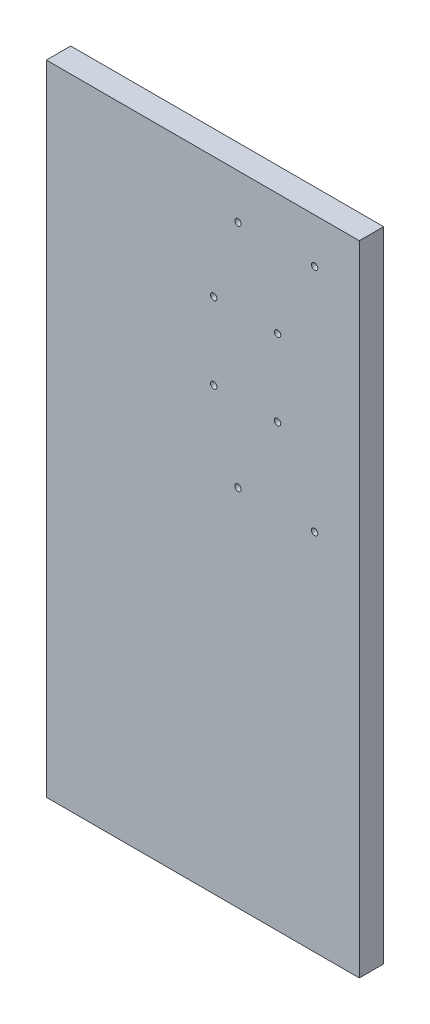
ISO-10303-21;
HEADER;
FILE_DESCRIPTION(('STEP AP214'),'2;1');
FILE_NAME('part.step','',(''),(''),'','','');
FILE_SCHEMA(('AUTOMOTIVE_DESIGN { 1 0 10303 214 1 1 1 1 }'));
ENDSEC;
DATA;
#1=APPLICATION_CONTEXT('core data for automotive mechanical design processes');
#2=APPLICATION_PROTOCOL_DEFINITION('international standard','automotive_design',2000,#1);
#3=PRODUCT_CONTEXT('',#1,'mechanical');
#4=PRODUCT('Part','Part','',(#3));
#5=PRODUCT_RELATED_PRODUCT_CATEGORY('part','',(#4));
#6=PRODUCT_DEFINITION_FORMATION('','',#4);
#7=PRODUCT_DEFINITION_CONTEXT('part definition',#1,'design');
#8=PRODUCT_DEFINITION('design','',#6,#7);
#9=PRODUCT_DEFINITION_SHAPE('','',#8);
#10=(LENGTH_UNIT() NAMED_UNIT(*) SI_UNIT(.MILLI.,.METRE.));
#11=(NAMED_UNIT(*) PLANE_ANGLE_UNIT() SI_UNIT($,.RADIAN.));
#12=(NAMED_UNIT(*) SI_UNIT($,.STERADIAN.) SOLID_ANGLE_UNIT());
#13=UNCERTAINTY_MEASURE_WITH_UNIT(LENGTH_MEASURE(1.E-05),#10,'distance_accuracy_value','');
#14=(GEOMETRIC_REPRESENTATION_CONTEXT(3) GLOBAL_UNCERTAINTY_ASSIGNED_CONTEXT((#13)) GLOBAL_UNIT_ASSIGNED_CONTEXT((#10,
#11,#12)) REPRESENTATION_CONTEXT('',''));
#15=CARTESIAN_POINT('',(0.,0.,0.));
#16=DIRECTION('',(0.,0.,1.));
#17=DIRECTION('',(1.,0.,0.));
#18=AXIS2_PLACEMENT_3D('',#15,#16,#17);
#19=CARTESIAN_POINT('',(-245.05,250.,19.05));
#20=DIRECTION('',(1.,0.,0.));
#21=DIRECTION('',(0.,0.,-1.));
#22=AXIS2_PLACEMENT_3D('',#19,#20,#21);
#23=PLANE('',#22);
#24=DIRECTION('',(0.,-1.,0.));
#25=VECTOR('',#24,1.);
#26=CARTESIAN_POINT('',(-245.05,250.,0.));
#27=LINE('',#26,#25);
#28=CARTESIAN_POINT('',(-245.05,250.,0.));
#29=VERTEX_POINT('',#28);
#30=CARTESIAN_POINT('',(-245.05,-250.,0.));
#31=VERTEX_POINT('',#30);
#32=EDGE_CURVE('E95',#29,#31,#27,.T.);
#33=ORIENTED_EDGE('',*,*,#32,.T.);
#34=DIRECTION('',(0.,0.,-1.));
#35=VECTOR('',#34,1.);
#36=CARTESIAN_POINT('',(-245.05,-250.,19.05));
#37=LINE('',#36,#35);
#38=CARTESIAN_POINT('',(-245.05,-250.,19.05));
#39=VERTEX_POINT('',#38);
#40=EDGE_CURVE('E11',#39,#31,#37,.T.);
#41=ORIENTED_EDGE('',*,*,#40,.F.);
#42=DIRECTION('',(0.,-1.,0.));
#43=VECTOR('',#42,1.);
#44=CARTESIAN_POINT('',(-245.05,250.,19.05));
#45=LINE('',#44,#43);
#46=CARTESIAN_POINT('',(-245.05,250.,19.05));
#47=VERTEX_POINT('',#46);
#48=EDGE_CURVE('E83',#47,#39,#45,.T.);
#49=ORIENTED_EDGE('',*,*,#48,.F.);
#50=DIRECTION('',(0.,0.,-1.));
#51=VECTOR('',#50,1.);
#52=CARTESIAN_POINT('',(-245.05,250.,19.05));
#53=LINE('',#52,#51);
#54=EDGE_CURVE('E91',#47,#29,#53,.T.);
#55=ORIENTED_EDGE('',*,*,#54,.T.);
#56=EDGE_LOOP('',(#33,#41,#49,#55));
#57=FACE_BOUND('',#56,.T.);
#58=ADVANCED_FACE('F32',(#57),#23,.F.);
#59=CARTESIAN_POINT('',(-245.05,-250.,19.05));
#60=DIRECTION('',(0.,1.,0.));
#61=DIRECTION('',(0.,0.,1.));
#62=AXIS2_PLACEMENT_3D('',#59,#60,#61);
#63=PLANE('',#62);
#64=DIRECTION('',(1.,0.,0.));
#65=VECTOR('',#64,1.);
#66=CARTESIAN_POINT('',(-245.05,-250.,0.));
#67=LINE('',#66,#65);
#68=CARTESIAN_POINT('',(0.,-250.,0.));
#69=VERTEX_POINT('',#68);
#70=EDGE_CURVE('E87',#31,#69,#67,.T.);
#71=ORIENTED_EDGE('',*,*,#70,.T.);
#72=DIRECTION('',(0.,0.,-1.));
#73=VECTOR('',#72,1.);
#74=CARTESIAN_POINT('',(0.,-250.,19.05));
#75=LINE('',#74,#73);
#76=CARTESIAN_POINT('',(0.,-250.,19.05));
#77=VERTEX_POINT('',#76);
#78=EDGE_CURVE('E40',#77,#69,#75,.T.);
#79=ORIENTED_EDGE('',*,*,#78,.F.);
#80=DIRECTION('',(1.,0.,0.));
#81=VECTOR('',#80,1.);
#82=CARTESIAN_POINT('',(-245.05,-250.,19.05));
#83=LINE('',#82,#81);
#84=EDGE_CURVE('E78',#39,#77,#83,.T.);
#85=ORIENTED_EDGE('',*,*,#84,.F.);
#86=ORIENTED_EDGE('',*,*,#40,.T.);
#87=EDGE_LOOP('',(#71,#79,#85,#86));
#88=FACE_BOUND('',#87,.T.);
#89=ADVANCED_FACE('F86',(#88),#63,.F.);
#90=CARTESIAN_POINT('',(0.,250.,19.05));
#91=DIRECTION('',(-1.,0.,0.));
#92=DIRECTION('',(0.,0.,1.));
#93=AXIS2_PLACEMENT_3D('',#90,#91,#92);
#94=PLANE('',#93);
#95=DIRECTION('',(0.,1.,0.));
#96=VECTOR('',#95,1.);
#97=CARTESIAN_POINT('',(0.,250.,0.));
#98=LINE('',#97,#96);
#99=CARTESIAN_POINT('',(0.,250.,0.));
#100=VERTEX_POINT('',#99);
#101=EDGE_CURVE('E65',#69,#100,#98,.T.);
#102=ORIENTED_EDGE('',*,*,#101,.T.);
#103=DIRECTION('',(0.,0.,-1.));
#104=VECTOR('',#103,1.);
#105=CARTESIAN_POINT('',(0.,250.,19.05));
#106=LINE('',#105,#104);
#107=CARTESIAN_POINT('',(0.,250.,19.05));
#108=VERTEX_POINT('',#107);
#109=EDGE_CURVE('E88',#108,#100,#106,.T.);
#110=ORIENTED_EDGE('',*,*,#109,.F.);
#111=DIRECTION('',(0.,1.,0.));
#112=VECTOR('',#111,1.);
#113=CARTESIAN_POINT('',(0.,250.,19.05));
#114=LINE('',#113,#112);
#115=EDGE_CURVE('E81',#77,#108,#114,.T.);
#116=ORIENTED_EDGE('',*,*,#115,.F.);
#117=ORIENTED_EDGE('',*,*,#78,.T.);
#118=EDGE_LOOP('',(#102,#110,#116,#117));
#119=FACE_BOUND('',#118,.T.);
#120=ADVANCED_FACE('F89',(#119),#94,.F.);
#121=CARTESIAN_POINT('',(-245.05,250.,19.05));
#122=DIRECTION('',(0.,-1.,0.));
#123=DIRECTION('',(0.,0.,-1.));
#124=AXIS2_PLACEMENT_3D('',#121,#122,#123);
#125=PLANE('',#124);
#126=DIRECTION('',(-1.,0.,0.));
#127=VECTOR('',#126,1.);
#128=CARTESIAN_POINT('',(-245.05,250.,0.));
#129=LINE('',#128,#127);
#130=EDGE_CURVE('E71',#100,#29,#129,.T.);
#131=ORIENTED_EDGE('',*,*,#130,.T.);
#132=ORIENTED_EDGE('',*,*,#54,.F.);
#133=DIRECTION('',(-1.,0.,0.));
#134=VECTOR('',#133,1.);
#135=CARTESIAN_POINT('',(-245.05,250.,19.05));
#136=LINE('',#135,#134);
#137=EDGE_CURVE('E48',#108,#47,#136,.T.);
#138=ORIENTED_EDGE('',*,*,#137,.F.);
#139=ORIENTED_EDGE('',*,*,#109,.T.);
#140=EDGE_LOOP('',(#131,#132,#138,#139));
#141=FACE_BOUND('',#140,.T.);
#142=ADVANCED_FACE('F103',(#141),#125,.F.);
#143=CARTESIAN_POINT('',(0.,0.,19.05));
#144=DIRECTION('',(0.,0.,1.));
#145=DIRECTION('',(1.,0.,0.));
#146=AXIS2_PLACEMENT_3D('',#143,#144,#145);
#147=PLANE('',#146);
#148=CARTESIAN_POINT('',(-35.,35.,19.05));
#149=DIRECTION('',(0.,0.,1.));
#150=DIRECTION('',(1.,0.,0.));
#151=AXIS2_PLACEMENT_3D('',#148,#149,#150);
#152=CIRCLE('',#151,2.5);
#153=CARTESIAN_POINT('',(-32.5,35.,19.05));
#154=VERTEX_POINT('',#153);
#155=EDGE_CURVE('E150',#154,#154,#152,.T.);
#156=ORIENTED_EDGE('',*,*,#155,.F.);
#157=EDGE_LOOP('',(#156));
#158=FACE_BOUND('',#157,.T.);
#159=CARTESIAN_POINT('',(-95.,35.,19.05));
#160=DIRECTION('',(0.,0.,1.));
#161=DIRECTION('',(1.,0.,0.));
#162=AXIS2_PLACEMENT_3D('',#159,#160,#161);
#163=CIRCLE('',#162,2.5);
#164=CARTESIAN_POINT('',(-92.5,35.,19.05));
#165=VERTEX_POINT('',#164);
#166=EDGE_CURVE('E144',#165,#165,#163,.T.);
#167=ORIENTED_EDGE('',*,*,#166,.F.);
#168=EDGE_LOOP('',(#167));
#169=FACE_BOUND('',#168,.T.);
#170=CARTESIAN_POINT('',(-114.,95.0000000000003,19.05));
#171=DIRECTION('',(0.,0.,1.));
#172=DIRECTION('',(1.,0.,0.));
#173=AXIS2_PLACEMENT_3D('',#170,#171,#172);
#174=CIRCLE('',#173,2.5);
#175=CARTESIAN_POINT('',(-111.5,95.0000000000003,19.05));
#176=VERTEX_POINT('',#175);
#177=EDGE_CURVE('E138',#176,#176,#174,.T.);
#178=ORIENTED_EDGE('',*,*,#177,.F.);
#179=EDGE_LOOP('',(#178));
#180=FACE_BOUND('',#179,.T.);
#181=CARTESIAN_POINT('',(-64.0000000000019,95.0000000000772,19.05));
#182=DIRECTION('',(0.,0.,1.));
#183=DIRECTION('',(1.,0.,0.));
#184=AXIS2_PLACEMENT_3D('',#181,#182,#183);
#185=CIRCLE('',#184,2.5);
#186=CARTESIAN_POINT('',(-61.5000000000019,95.0000000000772,19.05));
#187=VERTEX_POINT('',#186);
#188=EDGE_CURVE('E132',#187,#187,#185,.T.);
#189=ORIENTED_EDGE('',*,*,#188,.F.);
#190=EDGE_LOOP('',(#189));
#191=FACE_BOUND('',#190,.T.);
#192=CARTESIAN_POINT('',(-64.0000000000019,155.000000000077,19.05));
#193=DIRECTION('',(0.,0.,1.));
#194=DIRECTION('',(1.,0.,0.));
#195=AXIS2_PLACEMENT_3D('',#192,#193,#194);
#196=CIRCLE('',#195,2.5);
#197=CARTESIAN_POINT('',(-61.5000000000019,155.000000000077,19.05));
#198=VERTEX_POINT('',#197);
#199=EDGE_CURVE('E126',#198,#198,#196,.T.);
#200=ORIENTED_EDGE('',*,*,#199,.F.);
#201=EDGE_LOOP('',(#200));
#202=FACE_BOUND('',#201,.T.);
#203=CARTESIAN_POINT('',(-35.,215.,19.05));
#204=DIRECTION('',(0.,0.,1.));
#205=DIRECTION('',(1.,0.,0.));
#206=AXIS2_PLACEMENT_3D('',#203,#204,#205);
#207=CIRCLE('',#206,2.5);
#208=CARTESIAN_POINT('',(-32.5,215.,19.05));
#209=VERTEX_POINT('',#208);
#210=EDGE_CURVE('E120',#209,#209,#207,.T.);
#211=ORIENTED_EDGE('',*,*,#210,.F.);
#212=EDGE_LOOP('',(#211));
#213=FACE_BOUND('',#212,.T.);
#214=CARTESIAN_POINT('',(-95.,215.,19.05));
#215=DIRECTION('',(0.,0.,1.));
#216=DIRECTION('',(1.,0.,0.));
#217=AXIS2_PLACEMENT_3D('',#214,#215,#216);
#218=CIRCLE('',#217,2.5);
#219=CARTESIAN_POINT('',(-92.5,215.,19.05));
#220=VERTEX_POINT('',#219);
#221=EDGE_CURVE('E114',#220,#220,#218,.T.);
#222=ORIENTED_EDGE('',*,*,#221,.F.);
#223=EDGE_LOOP('',(#222));
#224=FACE_BOUND('',#223,.T.);
#225=CARTESIAN_POINT('',(-114.,155.,19.05));
#226=DIRECTION('',(0.,0.,1.));
#227=DIRECTION('',(1.,0.,0.));
#228=AXIS2_PLACEMENT_3D('',#225,#226,#227);
#229=CIRCLE('',#228,2.5);
#230=CARTESIAN_POINT('',(-111.5,155.,19.05));
#231=VERTEX_POINT('',#230);
#232=EDGE_CURVE('E98',#231,#231,#229,.T.);
#233=ORIENTED_EDGE('',*,*,#232,.F.);
#234=EDGE_LOOP('',(#233));
#235=FACE_BOUND('',#234,.T.);
#236=ORIENTED_EDGE('',*,*,#48,.T.);
#237=ORIENTED_EDGE('',*,*,#84,.T.);
#238=ORIENTED_EDGE('',*,*,#115,.T.);
#239=ORIENTED_EDGE('',*,*,#137,.T.);
#240=EDGE_LOOP('',(#236,#237,#238,#239));
#241=FACE_BOUND('',#240,.T.);
#242=ADVANCED_FACE('F79',(#158,#169,#180,#191,#202,#213,#224,#235,#241),#147,.T.);
#243=CARTESIAN_POINT('',(0.,0.,0.));
#244=DIRECTION('',(0.,0.,1.));
#245=DIRECTION('',(1.,0.,0.));
#246=AXIS2_PLACEMENT_3D('',#243,#244,#245);
#247=PLANE('',#246);
#248=CARTESIAN_POINT('',(-35.,35.,0.));
#249=DIRECTION('',(0.,0.,-1.));
#250=DIRECTION('',(-1.,0.,0.));
#251=AXIS2_PLACEMENT_3D('',#248,#249,#250);
#252=CIRCLE('',#251,2.5);
#253=CARTESIAN_POINT('',(-37.5,35.,0.));
#254=VERTEX_POINT('',#253);
#255=EDGE_CURVE('E153',#254,#254,#252,.T.);
#256=ORIENTED_EDGE('',*,*,#255,.F.);
#257=EDGE_LOOP('',(#256));
#258=FACE_BOUND('',#257,.T.);
#259=CARTESIAN_POINT('',(-95.,35.,0.));
#260=DIRECTION('',(0.,0.,-1.));
#261=DIRECTION('',(-1.,0.,0.));
#262=AXIS2_PLACEMENT_3D('',#259,#260,#261);
#263=CIRCLE('',#262,2.5);
#264=CARTESIAN_POINT('',(-97.5,35.,0.));
#265=VERTEX_POINT('',#264);
#266=EDGE_CURVE('E147',#265,#265,#263,.T.);
#267=ORIENTED_EDGE('',*,*,#266,.F.);
#268=EDGE_LOOP('',(#267));
#269=FACE_BOUND('',#268,.T.);
#270=CARTESIAN_POINT('',(-114.,95.0000000000003,0.));
#271=DIRECTION('',(0.,0.,-1.));
#272=DIRECTION('',(-1.,0.,0.));
#273=AXIS2_PLACEMENT_3D('',#270,#271,#272);
#274=CIRCLE('',#273,2.5);
#275=CARTESIAN_POINT('',(-116.5,95.0000000000003,0.));
#276=VERTEX_POINT('',#275);
#277=EDGE_CURVE('E141',#276,#276,#274,.T.);
#278=ORIENTED_EDGE('',*,*,#277,.F.);
#279=EDGE_LOOP('',(#278));
#280=FACE_BOUND('',#279,.T.);
#281=CARTESIAN_POINT('',(-64.0000000000019,95.0000000000772,0.));
#282=DIRECTION('',(0.,0.,-1.));
#283=DIRECTION('',(-1.,0.,0.));
#284=AXIS2_PLACEMENT_3D('',#281,#282,#283);
#285=CIRCLE('',#284,2.5);
#286=CARTESIAN_POINT('',(-66.5000000000019,95.0000000000772,0.));
#287=VERTEX_POINT('',#286);
#288=EDGE_CURVE('E135',#287,#287,#285,.T.);
#289=ORIENTED_EDGE('',*,*,#288,.F.);
#290=EDGE_LOOP('',(#289));
#291=FACE_BOUND('',#290,.T.);
#292=CARTESIAN_POINT('',(-64.0000000000019,155.000000000077,0.));
#293=DIRECTION('',(0.,0.,-1.));
#294=DIRECTION('',(-1.,0.,0.));
#295=AXIS2_PLACEMENT_3D('',#292,#293,#294);
#296=CIRCLE('',#295,2.5);
#297=CARTESIAN_POINT('',(-66.5000000000019,155.000000000077,0.));
#298=VERTEX_POINT('',#297);
#299=EDGE_CURVE('E129',#298,#298,#296,.T.);
#300=ORIENTED_EDGE('',*,*,#299,.F.);
#301=EDGE_LOOP('',(#300));
#302=FACE_BOUND('',#301,.T.);
#303=CARTESIAN_POINT('',(-35.,215.,0.));
#304=DIRECTION('',(0.,0.,-1.));
#305=DIRECTION('',(-1.,0.,0.));
#306=AXIS2_PLACEMENT_3D('',#303,#304,#305);
#307=CIRCLE('',#306,2.5);
#308=CARTESIAN_POINT('',(-37.5,215.,0.));
#309=VERTEX_POINT('',#308);
#310=EDGE_CURVE('E123',#309,#309,#307,.T.);
#311=ORIENTED_EDGE('',*,*,#310,.F.);
#312=EDGE_LOOP('',(#311));
#313=FACE_BOUND('',#312,.T.);
#314=CARTESIAN_POINT('',(-95.,215.,0.));
#315=DIRECTION('',(0.,0.,-1.));
#316=DIRECTION('',(-1.,0.,0.));
#317=AXIS2_PLACEMENT_3D('',#314,#315,#316);
#318=CIRCLE('',#317,2.5);
#319=CARTESIAN_POINT('',(-97.5,215.,0.));
#320=VERTEX_POINT('',#319);
#321=EDGE_CURVE('E117',#320,#320,#318,.T.);
#322=ORIENTED_EDGE('',*,*,#321,.F.);
#323=EDGE_LOOP('',(#322));
#324=FACE_BOUND('',#323,.T.);
#325=CARTESIAN_POINT('',(-114.,155.,0.));
#326=DIRECTION('',(0.,0.,-1.));
#327=DIRECTION('',(-1.,0.,0.));
#328=AXIS2_PLACEMENT_3D('',#325,#326,#327);
#329=CIRCLE('',#328,2.5);
#330=CARTESIAN_POINT('',(-116.5,155.,0.));
#331=VERTEX_POINT('',#330);
#332=EDGE_CURVE('E111',#331,#331,#329,.T.);
#333=ORIENTED_EDGE('',*,*,#332,.F.);
#334=EDGE_LOOP('',(#333));
#335=FACE_BOUND('',#334,.T.);
#336=ORIENTED_EDGE('',*,*,#32,.F.);
#337=ORIENTED_EDGE('',*,*,#130,.F.);
#338=ORIENTED_EDGE('',*,*,#101,.F.);
#339=ORIENTED_EDGE('',*,*,#70,.F.);
#340=EDGE_LOOP('',(#336,#337,#338,#339));
#341=FACE_BOUND('',#340,.T.);
#342=ADVANCED_FACE('F106',(#258,#269,#280,#291,#302,#313,#324,#335,#341),#247,.F.);
#343=CARTESIAN_POINT('',(-114.,155.,0.));
#344=DIRECTION('',(0.,0.,-1.));
#345=DIRECTION('',(-1.,0.,0.));
#346=AXIS2_PLACEMENT_3D('',#343,#344,#345);
#347=CYLINDRICAL_SURFACE('',#346,2.5);
#348=ORIENTED_EDGE('',*,*,#232,.T.);
#349=EDGE_LOOP('',(#348));
#350=FACE_BOUND('',#349,.T.);
#351=ORIENTED_EDGE('',*,*,#332,.T.);
#352=EDGE_LOOP('',(#351));
#353=FACE_BOUND('',#352,.T.);
#354=ADVANCED_FACE('F161',(#350,#353),#347,.F.);
#355=CARTESIAN_POINT('',(-95.,215.,0.));
#356=DIRECTION('',(0.,0.,-1.));
#357=DIRECTION('',(-1.,0.,0.));
#358=AXIS2_PLACEMENT_3D('',#355,#356,#357);
#359=CYLINDRICAL_SURFACE('',#358,2.5);
#360=ORIENTED_EDGE('',*,*,#221,.T.);
#361=EDGE_LOOP('',(#360));
#362=FACE_BOUND('',#361,.T.);
#363=ORIENTED_EDGE('',*,*,#321,.T.);
#364=EDGE_LOOP('',(#363));
#365=FACE_BOUND('',#364,.T.);
#366=ADVANCED_FACE('F178',(#362,#365),#359,.F.);
#367=CARTESIAN_POINT('',(-35.,215.,0.));
#368=DIRECTION('',(0.,0.,-1.));
#369=DIRECTION('',(-1.,0.,0.));
#370=AXIS2_PLACEMENT_3D('',#367,#368,#369);
#371=CYLINDRICAL_SURFACE('',#370,2.5);
#372=ORIENTED_EDGE('',*,*,#210,.T.);
#373=EDGE_LOOP('',(#372));
#374=FACE_BOUND('',#373,.T.);
#375=ORIENTED_EDGE('',*,*,#310,.T.);
#376=EDGE_LOOP('',(#375));
#377=FACE_BOUND('',#376,.T.);
#378=ADVANCED_FACE('F185',(#374,#377),#371,.F.);
#379=CARTESIAN_POINT('',(-64.0000000000019,155.000000000077,0.));
#380=DIRECTION('',(0.,0.,-1.));
#381=DIRECTION('',(-1.,0.,0.));
#382=AXIS2_PLACEMENT_3D('',#379,#380,#381);
#383=CYLINDRICAL_SURFACE('',#382,2.5);
#384=ORIENTED_EDGE('',*,*,#199,.T.);
#385=EDGE_LOOP('',(#384));
#386=FACE_BOUND('',#385,.T.);
#387=ORIENTED_EDGE('',*,*,#299,.T.);
#388=EDGE_LOOP('',(#387));
#389=FACE_BOUND('',#388,.T.);
#390=ADVANCED_FACE('F223',(#386,#389),#383,.F.);
#391=CARTESIAN_POINT('',(-64.0000000000019,95.0000000000772,0.));
#392=DIRECTION('',(0.,0.,-1.));
#393=DIRECTION('',(-1.,0.,0.));
#394=AXIS2_PLACEMENT_3D('',#391,#392,#393);
#395=CYLINDRICAL_SURFACE('',#394,2.5);
#396=ORIENTED_EDGE('',*,*,#188,.T.);
#397=EDGE_LOOP('',(#396));
#398=FACE_BOUND('',#397,.T.);
#399=ORIENTED_EDGE('',*,*,#288,.T.);
#400=EDGE_LOOP('',(#399));
#401=FACE_BOUND('',#400,.T.);
#402=ADVANCED_FACE('F228',(#398,#401),#395,.F.);
#403=CARTESIAN_POINT('',(-114.,95.0000000000003,0.));
#404=DIRECTION('',(0.,0.,-1.));
#405=DIRECTION('',(-1.,0.,0.));
#406=AXIS2_PLACEMENT_3D('',#403,#404,#405);
#407=CYLINDRICAL_SURFACE('',#406,2.5);
#408=ORIENTED_EDGE('',*,*,#177,.T.);
#409=EDGE_LOOP('',(#408));
#410=FACE_BOUND('',#409,.T.);
#411=ORIENTED_EDGE('',*,*,#277,.T.);
#412=EDGE_LOOP('',(#411));
#413=FACE_BOUND('',#412,.T.);
#414=ADVANCED_FACE('F234',(#410,#413),#407,.F.);
#415=CARTESIAN_POINT('',(-95.,35.,0.));
#416=DIRECTION('',(0.,0.,-1.));
#417=DIRECTION('',(-1.,0.,0.));
#418=AXIS2_PLACEMENT_3D('',#415,#416,#417);
#419=CYLINDRICAL_SURFACE('',#418,2.5);
#420=ORIENTED_EDGE('',*,*,#166,.T.);
#421=EDGE_LOOP('',(#420));
#422=FACE_BOUND('',#421,.T.);
#423=ORIENTED_EDGE('',*,*,#266,.T.);
#424=EDGE_LOOP('',(#423));
#425=FACE_BOUND('',#424,.T.);
#426=ADVANCED_FACE('F238',(#422,#425),#419,.F.);
#427=CARTESIAN_POINT('',(-35.,35.,0.));
#428=DIRECTION('',(0.,0.,-1.));
#429=DIRECTION('',(-1.,0.,0.));
#430=AXIS2_PLACEMENT_3D('',#427,#428,#429);
#431=CYLINDRICAL_SURFACE('',#430,2.5);
#432=ORIENTED_EDGE('',*,*,#155,.T.);
#433=EDGE_LOOP('',(#432));
#434=FACE_BOUND('',#433,.T.);
#435=ORIENTED_EDGE('',*,*,#255,.T.);
#436=EDGE_LOOP('',(#435));
#437=FACE_BOUND('',#436,.T.);
#438=ADVANCED_FACE('F157',(#434,#437),#431,.F.);
#439=CLOSED_SHELL('',(#58,#89,#120,#142,#242,#342,#354,#366,#378,#390,#402,#414,#426,#438));
#440=MANIFOLD_SOLID_BREP('B2',#439);
#441=ADVANCED_BREP_SHAPE_REPRESENTATION('',(#18,#440),#14);
#442=SHAPE_DEFINITION_REPRESENTATION(#9,#441);
ENDSEC;
END-ISO-10303-21;
